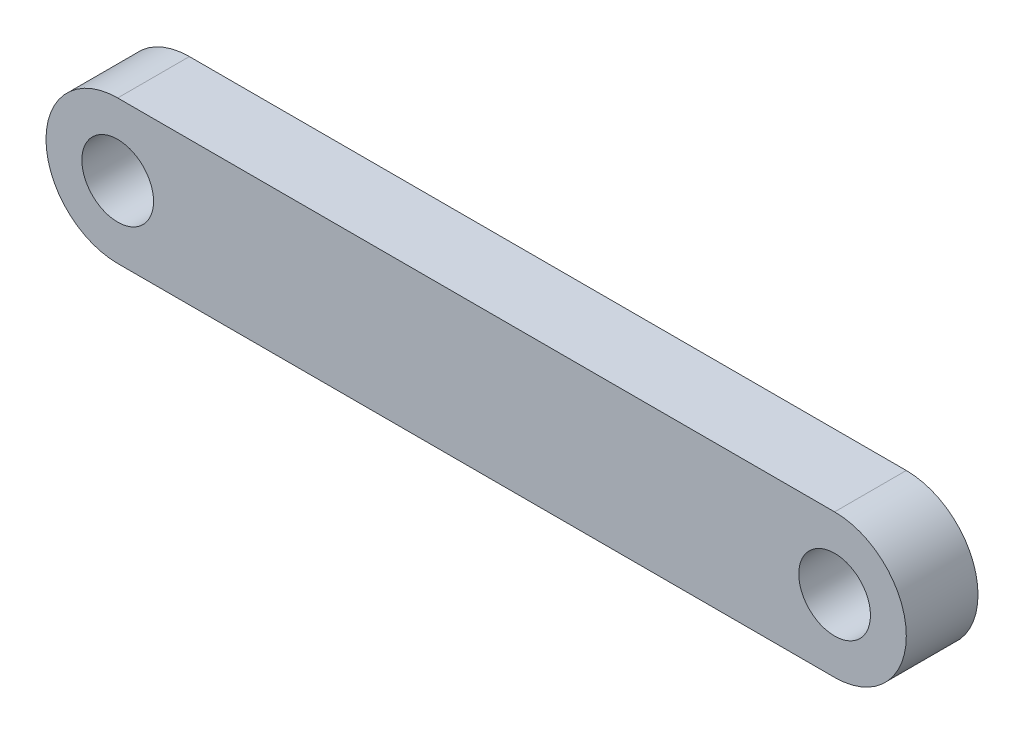
ISO-10303-21;
HEADER;
FILE_DESCRIPTION(('STEP AP214'),'2;1');
FILE_NAME('part.step','',(''),(''),'','','');
FILE_SCHEMA(('AUTOMOTIVE_DESIGN { 1 0 10303 214 1 1 1 1 }'));
ENDSEC;
DATA;
#1=APPLICATION_CONTEXT('core data for automotive mechanical design processes');
#2=APPLICATION_PROTOCOL_DEFINITION('international standard','automotive_design',2000,#1);
#3=PRODUCT_CONTEXT('',#1,'mechanical');
#4=PRODUCT('Part','Part','',(#3));
#5=PRODUCT_RELATED_PRODUCT_CATEGORY('part','',(#4));
#6=PRODUCT_DEFINITION_FORMATION('','',#4);
#7=PRODUCT_DEFINITION_CONTEXT('part definition',#1,'design');
#8=PRODUCT_DEFINITION('design','',#6,#7);
#9=PRODUCT_DEFINITION_SHAPE('','',#8);
#10=(LENGTH_UNIT() NAMED_UNIT(*) SI_UNIT(.MILLI.,.METRE.));
#11=(NAMED_UNIT(*) PLANE_ANGLE_UNIT() SI_UNIT($,.RADIAN.));
#12=(NAMED_UNIT(*) SI_UNIT($,.STERADIAN.) SOLID_ANGLE_UNIT());
#13=UNCERTAINTY_MEASURE_WITH_UNIT(LENGTH_MEASURE(1.E-05),#10,'distance_accuracy_value','');
#14=(GEOMETRIC_REPRESENTATION_CONTEXT(3) GLOBAL_UNCERTAINTY_ASSIGNED_CONTEXT((#13)) GLOBAL_UNIT_ASSIGNED_CONTEXT((#10,
#11,#12)) REPRESENTATION_CONTEXT('',''));
#15=CARTESIAN_POINT('',(0.,0.,0.));
#16=DIRECTION('',(0.,0.,1.));
#17=DIRECTION('',(1.,0.,0.));
#18=AXIS2_PLACEMENT_3D('',#15,#16,#17);
#19=CARTESIAN_POINT('',(50.,0.,5.));
#20=DIRECTION('',(0.,0.,1.));
#21=DIRECTION('',(1.,0.,0.));
#22=AXIS2_PLACEMENT_3D('',#19,#20,#21);
#23=PLANE('',#22);
#24=CARTESIAN_POINT('',(50.,0.,5.));
#25=DIRECTION('',(0.,0.,1.));
#26=DIRECTION('',(1.,0.,0.));
#27=AXIS2_PLACEMENT_3D('',#24,#25,#26);
#28=CIRCLE('',#27,5.);
#29=CARTESIAN_POINT('',(55.,0.,5.));
#30=VERTEX_POINT('',#29);
#31=EDGE_CURVE('E106',#30,#30,#28,.T.);
#32=ORIENTED_EDGE('',*,*,#31,.F.);
#33=EDGE_LOOP('',(#32));
#34=FACE_BOUND('',#33,.T.);
#35=CARTESIAN_POINT('',(50.,0.,5.));
#36=DIRECTION('',(0.,0.,1.));
#37=DIRECTION('',(1.,0.,0.));
#38=AXIS2_PLACEMENT_3D('',#35,#36,#37);
#39=CIRCLE('',#38,10.);
#40=CARTESIAN_POINT('',(50.,-10.,5.));
#41=VERTEX_POINT('',#40);
#42=CARTESIAN_POINT('',(50.,10.,5.));
#43=VERTEX_POINT('',#42);
#44=EDGE_CURVE('E91',#41,#43,#39,.T.);
#45=ORIENTED_EDGE('',*,*,#44,.T.);
#46=DIRECTION('',(-1.,0.,0.));
#47=VECTOR('',#46,1.);
#48=CARTESIAN_POINT('',(50.,10.,5.));
#49=LINE('',#48,#47);
#50=CARTESIAN_POINT('',(-50.,10.,5.));
#51=VERTEX_POINT('',#50);
#52=EDGE_CURVE('E86',#43,#51,#49,.T.);
#53=ORIENTED_EDGE('',*,*,#52,.T.);
#54=CARTESIAN_POINT('',(-50.,0.,5.));
#55=DIRECTION('',(0.,0.,1.));
#56=DIRECTION('',(1.,0.,0.));
#57=AXIS2_PLACEMENT_3D('',#54,#55,#56);
#58=CIRCLE('',#57,10.);
#59=CARTESIAN_POINT('',(-50.,-10.,5.));
#60=VERTEX_POINT('',#59);
#61=EDGE_CURVE('E89',#51,#60,#58,.T.);
#62=ORIENTED_EDGE('',*,*,#61,.T.);
#63=DIRECTION('',(1.,0.,0.));
#64=VECTOR('',#63,1.);
#65=CARTESIAN_POINT('',(-50.,-10.,5.));
#66=LINE('',#65,#64);
#67=EDGE_CURVE('E56',#60,#41,#66,.T.);
#68=ORIENTED_EDGE('',*,*,#67,.T.);
#69=EDGE_LOOP('',(#45,#53,#62,#68));
#70=FACE_BOUND('',#69,.T.);
#71=CARTESIAN_POINT('',(-50.,0.,5.));
#72=DIRECTION('',(0.,0.,1.));
#73=DIRECTION('',(1.,0.,0.));
#74=AXIS2_PLACEMENT_3D('',#71,#72,#73);
#75=CIRCLE('',#74,5.);
#76=CARTESIAN_POINT('',(-45.,0.,5.));
#77=VERTEX_POINT('',#76);
#78=EDGE_CURVE('E121',#77,#77,#75,.T.);
#79=ORIENTED_EDGE('',*,*,#78,.F.);
#80=EDGE_LOOP('',(#79));
#81=FACE_BOUND('',#80,.T.);
#82=ADVANCED_FACE('F39',(#34,#70,#81),#23,.T.);
#83=CARTESIAN_POINT('',(50.,0.,-5.));
#84=DIRECTION('',(0.,0.,1.));
#85=DIRECTION('',(1.,0.,0.));
#86=AXIS2_PLACEMENT_3D('',#83,#84,#85);
#87=PLANE('',#86);
#88=CARTESIAN_POINT('',(50.,0.,-5.));
#89=DIRECTION('',(0.,0.,1.));
#90=DIRECTION('',(1.,0.,0.));
#91=AXIS2_PLACEMENT_3D('',#88,#89,#90);
#92=CIRCLE('',#91,10.);
#93=CARTESIAN_POINT('',(50.,-10.,-5.));
#94=VERTEX_POINT('',#93);
#95=CARTESIAN_POINT('',(50.,10.,-5.));
#96=VERTEX_POINT('',#95);
#97=EDGE_CURVE('E103',#94,#96,#92,.T.);
#98=ORIENTED_EDGE('',*,*,#97,.F.);
#99=DIRECTION('',(1.,0.,0.));
#100=VECTOR('',#99,1.);
#101=CARTESIAN_POINT('',(-50.,-10.,-5.));
#102=LINE('',#101,#100);
#103=CARTESIAN_POINT('',(-50.,-10.,-5.));
#104=VERTEX_POINT('',#103);
#105=EDGE_CURVE('E79',#104,#94,#102,.T.);
#106=ORIENTED_EDGE('',*,*,#105,.F.);
#107=CARTESIAN_POINT('',(-50.,0.,-5.));
#108=DIRECTION('',(0.,0.,1.));
#109=DIRECTION('',(1.,0.,0.));
#110=AXIS2_PLACEMENT_3D('',#107,#108,#109);
#111=CIRCLE('',#110,10.);
#112=CARTESIAN_POINT('',(-50.,10.,-5.));
#113=VERTEX_POINT('',#112);
#114=EDGE_CURVE('E73',#113,#104,#111,.T.);
#115=ORIENTED_EDGE('',*,*,#114,.F.);
#116=DIRECTION('',(-1.,0.,0.));
#117=VECTOR('',#116,1.);
#118=CARTESIAN_POINT('',(50.,10.,-5.));
#119=LINE('',#118,#117);
#120=EDGE_CURVE('E95',#96,#113,#119,.T.);
#121=ORIENTED_EDGE('',*,*,#120,.F.);
#122=EDGE_LOOP('',(#98,#106,#115,#121));
#123=FACE_BOUND('',#122,.T.);
#124=CARTESIAN_POINT('',(50.,0.,-5.));
#125=DIRECTION('',(0.,0.,1.));
#126=DIRECTION('',(1.,0.,0.));
#127=AXIS2_PLACEMENT_3D('',#124,#125,#126);
#128=CIRCLE('',#127,5.);
#129=CARTESIAN_POINT('',(55.,0.,-5.));
#130=VERTEX_POINT('',#129);
#131=EDGE_CURVE('E118',#130,#130,#128,.T.);
#132=ORIENTED_EDGE('',*,*,#131,.T.);
#133=EDGE_LOOP('',(#132));
#134=FACE_BOUND('',#133,.T.);
#135=CARTESIAN_POINT('',(-50.,0.,-5.));
#136=DIRECTION('',(0.,0.,1.));
#137=DIRECTION('',(1.,0.,0.));
#138=AXIS2_PLACEMENT_3D('',#135,#136,#137);
#139=CIRCLE('',#138,5.);
#140=CARTESIAN_POINT('',(-45.,0.,-5.));
#141=VERTEX_POINT('',#140);
#142=EDGE_CURVE('E124',#141,#141,#139,.T.);
#143=ORIENTED_EDGE('',*,*,#142,.T.);
#144=EDGE_LOOP('',(#143));
#145=FACE_BOUND('',#144,.T.);
#146=ADVANCED_FACE('F114',(#123,#134,#145),#87,.F.);
#147=CARTESIAN_POINT('',(50.,0.,5.));
#148=DIRECTION('',(0.,0.,-1.));
#149=DIRECTION('',(-1.,0.,0.));
#150=AXIS2_PLACEMENT_3D('',#147,#148,#149);
#151=CYLINDRICAL_SURFACE('',#150,10.);
#152=ORIENTED_EDGE('',*,*,#97,.T.);
#153=DIRECTION('',(0.,0.,-1.));
#154=VECTOR('',#153,1.);
#155=CARTESIAN_POINT('',(50.,10.,5.));
#156=LINE('',#155,#154);
#157=EDGE_CURVE('E11',#43,#96,#156,.T.);
#158=ORIENTED_EDGE('',*,*,#157,.F.);
#159=ORIENTED_EDGE('',*,*,#44,.F.);
#160=DIRECTION('',(0.,0.,-1.));
#161=VECTOR('',#160,1.);
#162=CARTESIAN_POINT('',(50.,-10.,5.));
#163=LINE('',#162,#161);
#164=EDGE_CURVE('E99',#41,#94,#163,.T.);
#165=ORIENTED_EDGE('',*,*,#164,.T.);
#166=EDGE_LOOP('',(#152,#158,#159,#165));
#167=FACE_BOUND('',#166,.T.);
#168=ADVANCED_FACE('F41',(#167),#151,.T.);
#169=CARTESIAN_POINT('',(50.,10.,5.));
#170=DIRECTION('',(0.,-1.,0.));
#171=DIRECTION('',(0.,0.,-1.));
#172=AXIS2_PLACEMENT_3D('',#169,#170,#171);
#173=PLANE('',#172);
#174=ORIENTED_EDGE('',*,*,#120,.T.);
#175=DIRECTION('',(0.,0.,-1.));
#176=VECTOR('',#175,1.);
#177=CARTESIAN_POINT('',(-50.,10.,5.));
#178=LINE('',#177,#176);
#179=EDGE_CURVE('E48',#51,#113,#178,.T.);
#180=ORIENTED_EDGE('',*,*,#179,.F.);
#181=ORIENTED_EDGE('',*,*,#52,.F.);
#182=ORIENTED_EDGE('',*,*,#157,.T.);
#183=EDGE_LOOP('',(#174,#180,#181,#182));
#184=FACE_BOUND('',#183,.T.);
#185=ADVANCED_FACE('F94',(#184),#173,.F.);
#186=CARTESIAN_POINT('',(-50.,0.,5.));
#187=DIRECTION('',(0.,0.,-1.));
#188=DIRECTION('',(-1.,0.,0.));
#189=AXIS2_PLACEMENT_3D('',#186,#187,#188);
#190=CYLINDRICAL_SURFACE('',#189,10.);
#191=ORIENTED_EDGE('',*,*,#114,.T.);
#192=DIRECTION('',(0.,0.,-1.));
#193=VECTOR('',#192,1.);
#194=CARTESIAN_POINT('',(-50.,-10.,5.));
#195=LINE('',#194,#193);
#196=EDGE_CURVE('E96',#60,#104,#195,.T.);
#197=ORIENTED_EDGE('',*,*,#196,.F.);
#198=ORIENTED_EDGE('',*,*,#61,.F.);
#199=ORIENTED_EDGE('',*,*,#179,.T.);
#200=EDGE_LOOP('',(#191,#197,#198,#199));
#201=FACE_BOUND('',#200,.T.);
#202=ADVANCED_FACE('F97',(#201),#190,.T.);
#203=CARTESIAN_POINT('',(-50.,-10.,5.));
#204=DIRECTION('',(0.,1.,0.));
#205=DIRECTION('',(0.,0.,1.));
#206=AXIS2_PLACEMENT_3D('',#203,#204,#205);
#207=PLANE('',#206);
#208=ORIENTED_EDGE('',*,*,#105,.T.);
#209=ORIENTED_EDGE('',*,*,#164,.F.);
#210=ORIENTED_EDGE('',*,*,#67,.F.);
#211=ORIENTED_EDGE('',*,*,#196,.T.);
#212=EDGE_LOOP('',(#208,#209,#210,#211));
#213=FACE_BOUND('',#212,.T.);
#214=ADVANCED_FACE('F111',(#213),#207,.F.);
#215=CARTESIAN_POINT('',(50.,0.,5.));
#216=DIRECTION('',(0.,0.,-1.));
#217=DIRECTION('',(-1.,0.,0.));
#218=AXIS2_PLACEMENT_3D('',#215,#216,#217);
#219=CYLINDRICAL_SURFACE('',#218,5.);
#220=ORIENTED_EDGE('',*,*,#31,.T.);
#221=EDGE_LOOP('',(#220));
#222=FACE_BOUND('',#221,.T.);
#223=ORIENTED_EDGE('',*,*,#131,.F.);
#224=EDGE_LOOP('',(#223));
#225=FACE_BOUND('',#224,.T.);
#226=ADVANCED_FACE('F141',(#222,#225),#219,.F.);
#227=CARTESIAN_POINT('',(-50.,0.,5.));
#228=DIRECTION('',(0.,0.,-1.));
#229=DIRECTION('',(-1.,0.,0.));
#230=AXIS2_PLACEMENT_3D('',#227,#228,#229);
#231=CYLINDRICAL_SURFACE('',#230,5.);
#232=ORIENTED_EDGE('',*,*,#78,.T.);
#233=EDGE_LOOP('',(#232));
#234=FACE_BOUND('',#233,.T.);
#235=ORIENTED_EDGE('',*,*,#142,.F.);
#236=EDGE_LOOP('',(#235));
#237=FACE_BOUND('',#236,.T.);
#238=ADVANCED_FACE('F130',(#234,#237),#231,.F.);
#239=CLOSED_SHELL('',(#82,#146,#168,#185,#202,#214,#226,#238));
#240=MANIFOLD_SOLID_BREP('B2',#239);
#241=ADVANCED_BREP_SHAPE_REPRESENTATION('',(#18,#240),#14);
#242=SHAPE_DEFINITION_REPRESENTATION(#9,#241);
ENDSEC;
END-ISO-10303-21;
